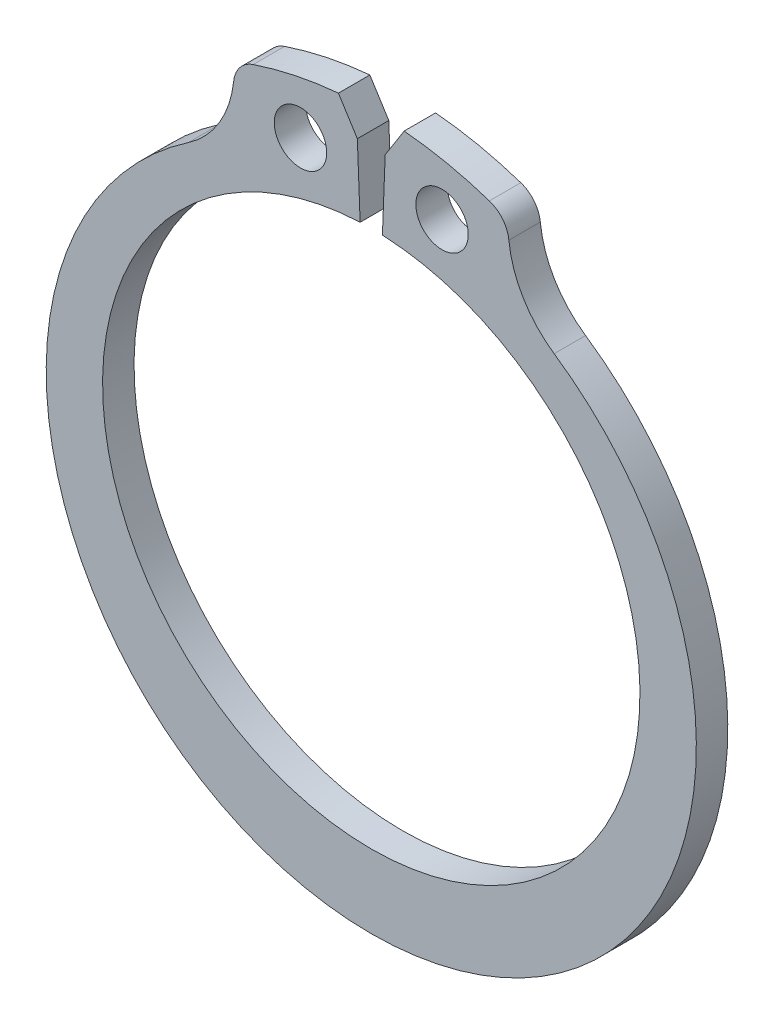
ISO-10303-21;
HEADER;
FILE_DESCRIPTION(('STEP AP214'),'2;1');
FILE_NAME('part.step','',(''),(''),'','','');
FILE_SCHEMA(('AUTOMOTIVE_DESIGN { 1 0 10303 214 1 1 1 1 }'));
ENDSEC;
DATA;
#1=APPLICATION_CONTEXT('core data for automotive mechanical design processes');
#2=APPLICATION_PROTOCOL_DEFINITION('international standard','automotive_design',2000,#1);
#3=PRODUCT_CONTEXT('',#1,'mechanical');
#4=PRODUCT('Part','Part','',(#3));
#5=PRODUCT_RELATED_PRODUCT_CATEGORY('part','',(#4));
#6=PRODUCT_DEFINITION_FORMATION('','',#4);
#7=PRODUCT_DEFINITION_CONTEXT('part definition',#1,'design');
#8=PRODUCT_DEFINITION('design','',#6,#7);
#9=PRODUCT_DEFINITION_SHAPE('','',#8);
#10=(LENGTH_UNIT() NAMED_UNIT(*) SI_UNIT(.MILLI.,.METRE.));
#11=(NAMED_UNIT(*) PLANE_ANGLE_UNIT() SI_UNIT($,.RADIAN.));
#12=(NAMED_UNIT(*) SI_UNIT($,.STERADIAN.) SOLID_ANGLE_UNIT());
#13=UNCERTAINTY_MEASURE_WITH_UNIT(LENGTH_MEASURE(1.E-05),#10,'distance_accuracy_value','');
#14=(GEOMETRIC_REPRESENTATION_CONTEXT(3) GLOBAL_UNCERTAINTY_ASSIGNED_CONTEXT((#13)) GLOBAL_UNIT_ASSIGNED_CONTEXT((#10,
#11,#12)) REPRESENTATION_CONTEXT('',''));
#15=CARTESIAN_POINT('',(0.,0.,0.));
#16=DIRECTION('',(0.,0.,1.));
#17=DIRECTION('',(1.,0.,0.));
#18=AXIS2_PLACEMENT_3D('',#15,#16,#17);
#19=CARTESIAN_POINT('',(4.55748367222768,0.231932071443037,1.2));
#20=DIRECTION('',(0.,0.,1.));
#21=DIRECTION('',(1.,0.,0.));
#22=AXIS2_PLACEMENT_3D('',#19,#20,#21);
#23=PLANE('',#22);
#24=CARTESIAN_POINT('',(2.7,11.8974787245029,1.2));
#25=DIRECTION('',(0.,0.,-1.));
#26=DIRECTION('',(1.,0.,0.));
#27=AXIS2_PLACEMENT_3D('',#24,#25,#26);
#28=CIRCLE('',#27,1.);
#29=CARTESIAN_POINT('',(1.7,11.8974787245029,1.2));
#30=VERTEX_POINT('',#29);
#31=EDGE_CURVE('E131',#30,#30,#28,.T.);
#32=ORIENTED_EDGE('',*,*,#31,.T.);
#33=EDGE_LOOP('',(#32));
#34=FACE_BOUND('',#33,.T.);
#35=CARTESIAN_POINT('',(-2.7,11.8974787245029,1.2));
#36=DIRECTION('',(0.,0.,-1.));
#37=DIRECTION('',(-1.,0.,0.));
#38=AXIS2_PLACEMENT_3D('',#35,#36,#37);
#39=CIRCLE('',#38,1.);
#40=CARTESIAN_POINT('',(-1.7,11.8974787245029,1.2));
#41=VERTEX_POINT('',#40);
#42=EDGE_CURVE('E117',#41,#41,#39,.T.);
#43=ORIENTED_EDGE('',*,*,#42,.T.);
#44=EDGE_LOOP('',(#43));
#45=FACE_BOUND('',#44,.T.);
#46=CARTESIAN_POINT('',(0.,0.,1.2));
#47=DIRECTION('',(0.,0.,-1.));
#48=DIRECTION('',(1.,0.,0.));
#49=AXIS2_PLACEMENT_3D('',#46,#47,#48);
#50=CIRCLE('',#49,10.25);
#51=CARTESIAN_POINT('',(0.425345306584372,10.2411708983967,1.2));
#52=VERTEX_POINT('',#51);
#53=CARTESIAN_POINT('',(-0.425345306584372,10.2411708983967,1.2));
#54=VERTEX_POINT('',#53);
#55=EDGE_CURVE('E148',#52,#54,#50,.T.);
#56=ORIENTED_EDGE('',*,*,#55,.T.);
#57=DIRECTION('',(-0.0390243902439026,0.999238258357881,0.));
#58=VECTOR('',#57,1.);
#59=CARTESIAN_POINT('',(0.,-0.65,1.2));
#60=LINE('',#59,#58);
#61=CARTESIAN_POINT('',(-0.531136295951343,12.95,1.2));
#62=VERTEX_POINT('',#61);
#63=EDGE_CURVE('E167',#54,#62,#60,.T.);
#64=ORIENTED_EDGE('',*,*,#63,.T.);
#65=DIRECTION('',(-0.533415242497357,0.845853521049293,0.));
#66=VECTOR('',#65,1.);
#67=CARTESIAN_POINT('',(-0.531136295951343,12.95,1.2));
#68=LINE('',#67,#66);
#69=CARTESIAN_POINT('',(-1.25283950188049,14.0944277351912,1.2));
#70=VERTEX_POINT('',#69);
#71=EDGE_CURVE('E128',#62,#70,#68,.T.);
#72=ORIENTED_EDGE('',*,*,#71,.T.);
#73=CARTESIAN_POINT('',(0.,0.,1.2));
#74=DIRECTION('',(0.,0.,-1.));
#75=DIRECTION('',(-1.,0.,0.));
#76=AXIS2_PLACEMENT_3D('',#73,#74,#75);
#77=CIRCLE('',#76,14.15);
#78=CARTESIAN_POINT('',(-4.50545087858349,13.4135533092716,1.2));
#79=VERTEX_POINT('',#78);
#80=EDGE_CURVE('E174',#79,#70,#77,.T.);
#81=ORIENTED_EDGE('',*,*,#80,.F.);
#82=CARTESIAN_POINT('',(-4.15520381381728,12.3708035820491,1.2));
#83=DIRECTION('',(0.,0.,-1.));
#84=DIRECTION('',(-1.,0.,0.));
#85=AXIS2_PLACEMENT_3D('',#82,#83,#84);
#86=CIRCLE('',#85,1.1);
#87=CARTESIAN_POINT('',(-5.24907893862705,12.4867225680799,1.2));
#88=VERTEX_POINT('',#87);
#89=EDGE_CURVE('E161',#88,#79,#86,.T.);
#90=ORIENTED_EDGE('',*,*,#89,.F.);
#91=CARTESIAN_POINT('',(-9.22680666520802,12.9082461536466,1.2));
#92=DIRECTION('',(0.,0.,-1.));
#93=DIRECTION('',(-1.,0.,0.));
#94=AXIS2_PLACEMENT_3D('',#91,#92,#93);
#95=CIRCLE('',#94,4.);
#96=CARTESIAN_POINT('',(-6.97636601515728,9.60135684787914,1.2));
#97=VERTEX_POINT('',#96);
#98=EDGE_CURVE('E129',#88,#97,#95,.T.);
#99=ORIENTED_EDGE('',*,*,#98,.T.);
#100=CARTESIAN_POINT('',(0.,-0.65,1.2));
#101=DIRECTION('',(0.,0.,-1.));
#102=DIRECTION('',(1.,0.,0.));
#103=AXIS2_PLACEMENT_3D('',#100,#101,#102);
#104=CIRCLE('',#103,12.4);
#105=CARTESIAN_POINT('',(6.97636601515728,9.60135684787914,1.2));
#106=VERTEX_POINT('',#105);
#107=EDGE_CURVE('E10',#106,#97,#104,.T.);
#108=ORIENTED_EDGE('',*,*,#107,.F.);
#109=CARTESIAN_POINT('',(9.22680666520802,12.9082461536466,1.2));
#110=DIRECTION('',(0.,0.,1.));
#111=DIRECTION('',(1.,0.,0.));
#112=AXIS2_PLACEMENT_3D('',#109,#110,#111);
#113=CIRCLE('',#112,4.);
#114=CARTESIAN_POINT('',(5.24907893862705,12.4867225680799,1.2));
#115=VERTEX_POINT('',#114);
#116=EDGE_CURVE('E158',#115,#106,#113,.T.);
#117=ORIENTED_EDGE('',*,*,#116,.F.);
#118=CARTESIAN_POINT('',(4.15520381381728,12.3708035820491,1.2));
#119=DIRECTION('',(0.,0.,-1.));
#120=DIRECTION('',(1.,0.,0.));
#121=AXIS2_PLACEMENT_3D('',#118,#119,#120);
#122=CIRCLE('',#121,1.1);
#123=CARTESIAN_POINT('',(4.50545087858349,13.4135533092716,1.2));
#124=VERTEX_POINT('',#123);
#125=EDGE_CURVE('E182',#124,#115,#122,.T.);
#126=ORIENTED_EDGE('',*,*,#125,.F.);
#127=CARTESIAN_POINT('',(0.,0.,1.2));
#128=DIRECTION('',(0.,0.,-1.));
#129=DIRECTION('',(1.,0.,0.));
#130=AXIS2_PLACEMENT_3D('',#127,#128,#129);
#131=CIRCLE('',#130,14.15);
#132=CARTESIAN_POINT('',(1.25283950188049,14.0944277351912,1.2));
#133=VERTEX_POINT('',#132);
#134=EDGE_CURVE('E195',#133,#124,#131,.T.);
#135=ORIENTED_EDGE('',*,*,#134,.F.);
#136=DIRECTION('',(0.533415242497357,0.845853521049293,0.));
#137=VECTOR('',#136,1.);
#138=CARTESIAN_POINT('',(0.531136295951343,12.95,1.2));
#139=LINE('',#138,#137);
#140=CARTESIAN_POINT('',(0.531136295951343,12.95,1.2));
#141=VERTEX_POINT('',#140);
#142=EDGE_CURVE('E133',#141,#133,#139,.T.);
#143=ORIENTED_EDGE('',*,*,#142,.F.);
#144=DIRECTION('',(0.0390243902439026,0.999238258357881,0.));
#145=VECTOR('',#144,1.);
#146=CARTESIAN_POINT('',(0.,-0.65,1.2));
#147=LINE('',#146,#145);
#148=EDGE_CURVE('E139',#52,#141,#147,.T.);
#149=ORIENTED_EDGE('',*,*,#148,.F.);
#150=EDGE_LOOP('',(#56,#64,#72,#81,#90,#99,#108,#117,#126,#135,#143,#149));
#151=FACE_BOUND('',#150,.T.);
#152=ADVANCED_FACE('F16',(#34,#45,#151),#23,.T.);
#153=CARTESIAN_POINT('',(0.,-0.65,0.));
#154=DIRECTION('',(0.,0.,-1.));
#155=DIRECTION('',(1.,0.,0.));
#156=AXIS2_PLACEMENT_3D('',#153,#154,#155);
#157=CYLINDRICAL_SURFACE('',#156,12.4);
#158=ORIENTED_EDGE('',*,*,#107,.T.);
#159=DIRECTION('',(0.,0.,-1.));
#160=VECTOR('',#159,1.);
#161=CARTESIAN_POINT('',(-6.97636601515728,9.60135684787914,1.2));
#162=LINE('',#161,#160);
#163=CARTESIAN_POINT('',(-6.97636601515728,9.60135684787914,0.));
#164=VERTEX_POINT('',#163);
#165=EDGE_CURVE('E132',#97,#164,#162,.T.);
#166=ORIENTED_EDGE('',*,*,#165,.T.);
#167=CARTESIAN_POINT('',(0.,-0.65,0.));
#168=DIRECTION('',(0.,0.,1.));
#169=DIRECTION('',(1.,0.,0.));
#170=AXIS2_PLACEMENT_3D('',#167,#168,#169);
#171=CIRCLE('',#170,12.4);
#172=CARTESIAN_POINT('',(6.97636601515728,9.60135684787914,0.));
#173=VERTEX_POINT('',#172);
#174=EDGE_CURVE('E149',#164,#173,#171,.T.);
#175=ORIENTED_EDGE('',*,*,#174,.T.);
#176=DIRECTION('',(0.,0.,1.));
#177=VECTOR('',#176,1.);
#178=CARTESIAN_POINT('',(6.97636601515728,9.60135684787914,0.));
#179=LINE('',#178,#177);
#180=EDGE_CURVE('E26',#173,#106,#179,.T.);
#181=ORIENTED_EDGE('',*,*,#180,.T.);
#182=EDGE_LOOP('',(#158,#166,#175,#181));
#183=FACE_BOUND('',#182,.T.);
#184=ADVANCED_FACE('F199',(#183),#157,.T.);
#185=CARTESIAN_POINT('',(9.22680666520802,12.9082461536466,0.));
#186=DIRECTION('',(0.,0.,-1.));
#187=DIRECTION('',(1.,0.,0.));
#188=AXIS2_PLACEMENT_3D('',#185,#186,#187);
#189=CYLINDRICAL_SURFACE('',#188,4.);
#190=ORIENTED_EDGE('',*,*,#116,.T.);
#191=ORIENTED_EDGE('',*,*,#180,.F.);
#192=CARTESIAN_POINT('',(9.22680666520802,12.9082461536466,0.));
#193=DIRECTION('',(0.,0.,1.));
#194=DIRECTION('',(1.,0.,0.));
#195=AXIS2_PLACEMENT_3D('',#192,#193,#194);
#196=CIRCLE('',#195,4.);
#197=CARTESIAN_POINT('',(5.24907893862705,12.4867225680799,0.));
#198=VERTEX_POINT('',#197);
#199=EDGE_CURVE('E152',#198,#173,#196,.T.);
#200=ORIENTED_EDGE('',*,*,#199,.F.);
#201=DIRECTION('',(0.,0.,1.));
#202=VECTOR('',#201,1.);
#203=CARTESIAN_POINT('',(5.24907893862705,12.4867225680799,0.));
#204=LINE('',#203,#202);
#205=EDGE_CURVE('E185',#198,#115,#204,.T.);
#206=ORIENTED_EDGE('',*,*,#205,.T.);
#207=EDGE_LOOP('',(#190,#191,#200,#206));
#208=FACE_BOUND('',#207,.T.);
#209=ADVANCED_FACE('F233',(#208),#189,.F.);
#210=CARTESIAN_POINT('',(4.15520381381728,12.3708035820491,0.));
#211=DIRECTION('',(0.,0.,-1.));
#212=DIRECTION('',(1.,0.,0.));
#213=AXIS2_PLACEMENT_3D('',#210,#211,#212);
#214=CYLINDRICAL_SURFACE('',#213,1.1);
#215=ORIENTED_EDGE('',*,*,#125,.T.);
#216=ORIENTED_EDGE('',*,*,#205,.F.);
#217=CARTESIAN_POINT('',(4.15520381381728,12.3708035820491,0.));
#218=DIRECTION('',(0.,0.,1.));
#219=DIRECTION('',(1.,0.,0.));
#220=AXIS2_PLACEMENT_3D('',#217,#218,#219);
#221=CIRCLE('',#220,1.1);
#222=CARTESIAN_POINT('',(4.50545087858349,13.4135533092716,0.));
#223=VERTEX_POINT('',#222);
#224=EDGE_CURVE('E153',#198,#223,#221,.T.);
#225=ORIENTED_EDGE('',*,*,#224,.T.);
#226=DIRECTION('',(0.,0.,1.));
#227=VECTOR('',#226,1.);
#228=CARTESIAN_POINT('',(4.50545087858349,13.4135533092716,0.));
#229=LINE('',#228,#227);
#230=EDGE_CURVE('E186',#223,#124,#229,.T.);
#231=ORIENTED_EDGE('',*,*,#230,.T.);
#232=EDGE_LOOP('',(#215,#216,#225,#231));
#233=FACE_BOUND('',#232,.T.);
#234=ADVANCED_FACE('F227',(#233),#214,.T.);
#235=CARTESIAN_POINT('',(0.,0.,0.));
#236=DIRECTION('',(0.,0.,-1.));
#237=DIRECTION('',(1.,0.,0.));
#238=AXIS2_PLACEMENT_3D('',#235,#236,#237);
#239=CYLINDRICAL_SURFACE('',#238,14.15);
#240=ORIENTED_EDGE('',*,*,#134,.T.);
#241=ORIENTED_EDGE('',*,*,#230,.F.);
#242=CARTESIAN_POINT('',(0.,0.,0.));
#243=DIRECTION('',(0.,0.,1.));
#244=DIRECTION('',(1.,0.,0.));
#245=AXIS2_PLACEMENT_3D('',#242,#243,#244);
#246=CIRCLE('',#245,14.15);
#247=CARTESIAN_POINT('',(1.25283950188049,14.0944277351912,0.));
#248=VERTEX_POINT('',#247);
#249=EDGE_CURVE('E156',#223,#248,#246,.T.);
#250=ORIENTED_EDGE('',*,*,#249,.T.);
#251=DIRECTION('',(0.,0.,1.));
#252=VECTOR('',#251,1.);
#253=CARTESIAN_POINT('',(1.25283950188049,14.0944277351912,0.));
#254=LINE('',#253,#252);
#255=EDGE_CURVE('E124',#248,#133,#254,.T.);
#256=ORIENTED_EDGE('',*,*,#255,.T.);
#257=EDGE_LOOP('',(#240,#241,#250,#256));
#258=FACE_BOUND('',#257,.T.);
#259=ADVANCED_FACE('F230',(#258),#239,.T.);
#260=CARTESIAN_POINT('',(0.891987898915916,13.5222138675956,0.));
#261=DIRECTION('',(-0.845853521049293,0.533415242497357,0.));
#262=DIRECTION('',(-0.533415242497357,-0.845853521049293,0.));
#263=AXIS2_PLACEMENT_3D('',#260,#261,#262);
#264=PLANE('',#263);
#265=ORIENTED_EDGE('',*,*,#142,.T.);
#266=ORIENTED_EDGE('',*,*,#255,.F.);
#267=DIRECTION('',(0.533415242497357,0.845853521049293,0.));
#268=VECTOR('',#267,1.);
#269=CARTESIAN_POINT('',(0.531136295951343,12.95,0.));
#270=LINE('',#269,#268);
#271=CARTESIAN_POINT('',(0.531136295951343,12.95,0.));
#272=VERTEX_POINT('',#271);
#273=EDGE_CURVE('E187',#272,#248,#270,.T.);
#274=ORIENTED_EDGE('',*,*,#273,.F.);
#275=DIRECTION('',(0.,0.,1.));
#276=VECTOR('',#275,1.);
#277=CARTESIAN_POINT('',(0.531136295951343,12.95,0.));
#278=LINE('',#277,#276);
#279=EDGE_CURVE('E135',#272,#141,#278,.T.);
#280=ORIENTED_EDGE('',*,*,#279,.T.);
#281=EDGE_LOOP('',(#265,#266,#274,#280));
#282=FACE_BOUND('',#281,.T.);
#283=ADVANCED_FACE('F256',(#282),#264,.T.);
#284=CARTESIAN_POINT('',(0.278260743283332,6.475,0.));
#285=DIRECTION('',(-0.999238258357881,0.0390243902439027,0.));
#286=DIRECTION('',(-0.0390243902439027,-0.999238258357881,0.));
#287=AXIS2_PLACEMENT_3D('',#284,#285,#286);
#288=PLANE('',#287);
#289=DIRECTION('',(0.,0.,1.));
#290=VECTOR('',#289,1.);
#291=CARTESIAN_POINT('',(0.425345306584372,10.2411708983967,0.6));
#292=LINE('',#291,#290);
#293=CARTESIAN_POINT('',(0.425345306584372,10.2411708983967,0.));
#294=VERTEX_POINT('',#293);
#295=EDGE_CURVE('E176',#294,#52,#292,.T.);
#296=ORIENTED_EDGE('',*,*,#295,.T.);
#297=ORIENTED_EDGE('',*,*,#148,.T.);
#298=ORIENTED_EDGE('',*,*,#279,.F.);
#299=DIRECTION('',(0.0390243902439026,0.999238258357881,0.));
#300=VECTOR('',#299,1.);
#301=CARTESIAN_POINT('',(0.,-0.65,0.));
#302=LINE('',#301,#300);
#303=EDGE_CURVE('E190',#294,#272,#302,.T.);
#304=ORIENTED_EDGE('',*,*,#303,.F.);
#305=EDGE_LOOP('',(#296,#297,#298,#304));
#306=FACE_BOUND('',#305,.T.);
#307=ADVANCED_FACE('F252',(#306),#288,.T.);
#308=CARTESIAN_POINT('',(2.7,11.8974787245029,0.6));
#309=DIRECTION('',(0.,0.,-1.));
#310=DIRECTION('',(1.,0.,0.));
#311=AXIS2_PLACEMENT_3D('',#308,#309,#310);
#312=CYLINDRICAL_SURFACE('',#311,1.);
#313=ORIENTED_EDGE('',*,*,#31,.F.);
#314=EDGE_LOOP('',(#313));
#315=FACE_BOUND('',#314,.T.);
#316=CARTESIAN_POINT('',(2.7,11.8974787245029,0.));
#317=DIRECTION('',(0.,0.,1.));
#318=DIRECTION('',(1.,0.,0.));
#319=AXIS2_PLACEMENT_3D('',#316,#317,#318);
#320=CIRCLE('',#319,1.);
#321=CARTESIAN_POINT('',(1.7,11.8974787245029,0.));
#322=VERTEX_POINT('',#321);
#323=EDGE_CURVE('E110',#322,#322,#320,.T.);
#324=ORIENTED_EDGE('',*,*,#323,.F.);
#325=EDGE_LOOP('',(#324));
#326=FACE_BOUND('',#325,.T.);
#327=ADVANCED_FACE('F255',(#315,#326),#312,.F.);
#328=CARTESIAN_POINT('',(-9.22680666520802,12.9082461536466,1.2));
#329=DIRECTION('',(0.,0.,1.));
#330=DIRECTION('',(-1.,0.,0.));
#331=AXIS2_PLACEMENT_3D('',#328,#329,#330);
#332=CYLINDRICAL_SURFACE('',#331,4.);
#333=CARTESIAN_POINT('',(-9.22680666520802,12.9082461536466,0.));
#334=DIRECTION('',(0.,0.,-1.));
#335=DIRECTION('',(-1.,0.,0.));
#336=AXIS2_PLACEMENT_3D('',#333,#334,#335);
#337=CIRCLE('',#336,4.);
#338=CARTESIAN_POINT('',(-5.24907893862705,12.4867225680799,0.));
#339=VERTEX_POINT('',#338);
#340=EDGE_CURVE('E142',#339,#164,#337,.T.);
#341=ORIENTED_EDGE('',*,*,#340,.T.);
#342=ORIENTED_EDGE('',*,*,#165,.F.);
#343=ORIENTED_EDGE('',*,*,#98,.F.);
#344=DIRECTION('',(0.,0.,-1.));
#345=VECTOR('',#344,1.);
#346=CARTESIAN_POINT('',(-5.24907893862705,12.4867225680799,1.2));
#347=LINE('',#346,#345);
#348=EDGE_CURVE('E163',#88,#339,#347,.T.);
#349=ORIENTED_EDGE('',*,*,#348,.T.);
#350=EDGE_LOOP('',(#341,#342,#343,#349));
#351=FACE_BOUND('',#350,.T.);
#352=ADVANCED_FACE('F205',(#351),#332,.F.);
#353=CARTESIAN_POINT('',(-4.15520381381728,12.3708035820491,1.2));
#354=DIRECTION('',(0.,0.,1.));
#355=DIRECTION('',(-1.,0.,0.));
#356=AXIS2_PLACEMENT_3D('',#353,#354,#355);
#357=CYLINDRICAL_SURFACE('',#356,1.1);
#358=CARTESIAN_POINT('',(-4.15520381381728,12.3708035820491,0.));
#359=DIRECTION('',(0.,0.,1.));
#360=DIRECTION('',(-1.,0.,0.));
#361=AXIS2_PLACEMENT_3D('',#358,#359,#360);
#362=CIRCLE('',#361,1.1);
#363=CARTESIAN_POINT('',(-4.50545087858349,13.4135533092716,0.));
#364=VERTEX_POINT('',#363);
#365=EDGE_CURVE('E140',#364,#339,#362,.T.);
#366=ORIENTED_EDGE('',*,*,#365,.T.);
#367=ORIENTED_EDGE('',*,*,#348,.F.);
#368=ORIENTED_EDGE('',*,*,#89,.T.);
#369=DIRECTION('',(0.,0.,-1.));
#370=VECTOR('',#369,1.);
#371=CARTESIAN_POINT('',(-4.50545087858349,13.4135533092716,1.2));
#372=LINE('',#371,#370);
#373=EDGE_CURVE('E20',#79,#364,#372,.T.);
#374=ORIENTED_EDGE('',*,*,#373,.T.);
#375=EDGE_LOOP('',(#366,#367,#368,#374));
#376=FACE_BOUND('',#375,.T.);
#377=ADVANCED_FACE('F284',(#376),#357,.T.);
#378=CARTESIAN_POINT('',(0.,0.,1.2));
#379=DIRECTION('',(0.,0.,1.));
#380=DIRECTION('',(-1.,0.,0.));
#381=AXIS2_PLACEMENT_3D('',#378,#379,#380);
#382=CYLINDRICAL_SURFACE('',#381,14.15);
#383=CARTESIAN_POINT('',(0.,0.,0.));
#384=DIRECTION('',(0.,0.,1.));
#385=DIRECTION('',(-1.,0.,0.));
#386=AXIS2_PLACEMENT_3D('',#383,#384,#385);
#387=CIRCLE('',#386,14.15);
#388=CARTESIAN_POINT('',(-1.25283950188049,14.0944277351912,0.));
#389=VERTEX_POINT('',#388);
#390=EDGE_CURVE('E120',#389,#364,#387,.T.);
#391=ORIENTED_EDGE('',*,*,#390,.T.);
#392=ORIENTED_EDGE('',*,*,#373,.F.);
#393=ORIENTED_EDGE('',*,*,#80,.T.);
#394=DIRECTION('',(0.,0.,-1.));
#395=VECTOR('',#394,1.);
#396=CARTESIAN_POINT('',(-1.25283950188049,14.0944277351912,1.2));
#397=LINE('',#396,#395);
#398=EDGE_CURVE('E126',#70,#389,#397,.T.);
#399=ORIENTED_EDGE('',*,*,#398,.T.);
#400=EDGE_LOOP('',(#391,#392,#393,#399));
#401=FACE_BOUND('',#400,.T.);
#402=ADVANCED_FACE('F282',(#401),#382,.T.);
#403=CARTESIAN_POINT('',(-0.891987898915916,13.5222138675956,1.2));
#404=DIRECTION('',(0.845853521049293,0.533415242497357,0.));
#405=DIRECTION('',(0.533415242497357,-0.845853521049293,0.));
#406=AXIS2_PLACEMENT_3D('',#403,#404,#405);
#407=PLANE('',#406);
#408=DIRECTION('',(-0.533415242497357,0.845853521049293,0.));
#409=VECTOR('',#408,1.);
#410=CARTESIAN_POINT('',(-0.531136295951343,12.95,0.));
#411=LINE('',#410,#409);
#412=CARTESIAN_POINT('',(-0.531136295951343,12.95,0.));
#413=VERTEX_POINT('',#412);
#414=EDGE_CURVE('E115',#413,#389,#411,.T.);
#415=ORIENTED_EDGE('',*,*,#414,.T.);
#416=ORIENTED_EDGE('',*,*,#398,.F.);
#417=ORIENTED_EDGE('',*,*,#71,.F.);
#418=DIRECTION('',(0.,0.,-1.));
#419=VECTOR('',#418,1.);
#420=CARTESIAN_POINT('',(-0.531136295951343,12.95,1.2));
#421=LINE('',#420,#419);
#422=EDGE_CURVE('E147',#62,#413,#421,.T.);
#423=ORIENTED_EDGE('',*,*,#422,.T.);
#424=EDGE_LOOP('',(#415,#416,#417,#423));
#425=FACE_BOUND('',#424,.T.);
#426=ADVANCED_FACE('F18',(#425),#407,.T.);
#427=CARTESIAN_POINT('',(-2.7,11.8974787245029,0.6));
#428=DIRECTION('',(0.,0.,1.));
#429=DIRECTION('',(-1.,0.,0.));
#430=AXIS2_PLACEMENT_3D('',#427,#428,#429);
#431=CYLINDRICAL_SURFACE('',#430,1.);
#432=CARTESIAN_POINT('',(-2.7,11.8974787245029,0.));
#433=DIRECTION('',(0.,0.,1.));
#434=DIRECTION('',(-1.,0.,0.));
#435=AXIS2_PLACEMENT_3D('',#432,#433,#434);
#436=CIRCLE('',#435,1.);
#437=CARTESIAN_POINT('',(-1.7,11.8974787245029,0.));
#438=VERTEX_POINT('',#437);
#439=EDGE_CURVE('E114',#438,#438,#436,.T.);
#440=ORIENTED_EDGE('',*,*,#439,.F.);
#441=EDGE_LOOP('',(#440));
#442=FACE_BOUND('',#441,.T.);
#443=ORIENTED_EDGE('',*,*,#42,.F.);
#444=EDGE_LOOP('',(#443));
#445=FACE_BOUND('',#444,.T.);
#446=ADVANCED_FACE('F302',(#442,#445),#431,.F.);
#447=CARTESIAN_POINT('',(4.55748367222768,0.231932071443037,0.));
#448=DIRECTION('',(0.,0.,1.));
#449=DIRECTION('',(1.,0.,0.));
#450=AXIS2_PLACEMENT_3D('',#447,#448,#449);
#451=PLANE('',#450);
#452=ORIENTED_EDGE('',*,*,#439,.T.);
#453=EDGE_LOOP('',(#452));
#454=FACE_BOUND('',#453,.T.);
#455=ORIENTED_EDGE('',*,*,#323,.T.);
#456=EDGE_LOOP('',(#455));
#457=FACE_BOUND('',#456,.T.);
#458=CARTESIAN_POINT('',(0.,0.,0.));
#459=DIRECTION('',(0.,0.,1.));
#460=DIRECTION('',(1.,0.,0.));
#461=AXIS2_PLACEMENT_3D('',#458,#459,#460);
#462=CIRCLE('',#461,10.25);
#463=CARTESIAN_POINT('',(-0.425345306584372,10.2411708983967,0.));
#464=VERTEX_POINT('',#463);
#465=EDGE_CURVE('E179',#464,#294,#462,.T.);
#466=ORIENTED_EDGE('',*,*,#465,.T.);
#467=ORIENTED_EDGE('',*,*,#303,.T.);
#468=ORIENTED_EDGE('',*,*,#273,.T.);
#469=ORIENTED_EDGE('',*,*,#249,.F.);
#470=ORIENTED_EDGE('',*,*,#224,.F.);
#471=ORIENTED_EDGE('',*,*,#199,.T.);
#472=ORIENTED_EDGE('',*,*,#174,.F.);
#473=ORIENTED_EDGE('',*,*,#340,.F.);
#474=ORIENTED_EDGE('',*,*,#365,.F.);
#475=ORIENTED_EDGE('',*,*,#390,.F.);
#476=ORIENTED_EDGE('',*,*,#414,.F.);
#477=DIRECTION('',(-0.0390243902439026,0.999238258357881,0.));
#478=VECTOR('',#477,1.);
#479=CARTESIAN_POINT('',(0.,-0.65,0.));
#480=LINE('',#479,#478);
#481=EDGE_CURVE('E144',#464,#413,#480,.T.);
#482=ORIENTED_EDGE('',*,*,#481,.F.);
#483=EDGE_LOOP('',(#466,#467,#468,#469,#470,#471,#472,#473,#474,#475,#476,#482));
#484=FACE_BOUND('',#483,.T.);
#485=ADVANCED_FACE('F111',(#454,#457,#484),#451,.F.);
#486=CARTESIAN_POINT('',(-0.278260743283332,6.475,1.2));
#487=DIRECTION('',(0.999238258357881,0.0390243902439027,0.));
#488=DIRECTION('',(0.0390243902439027,-0.999238258357881,0.));
#489=AXIS2_PLACEMENT_3D('',#486,#487,#488);
#490=PLANE('',#489);
#491=DIRECTION('',(0.,0.,-1.));
#492=VECTOR('',#491,1.);
#493=CARTESIAN_POINT('',(-0.425345306584372,10.2411708983967,0.6));
#494=LINE('',#493,#492);
#495=EDGE_CURVE('E170',#54,#464,#494,.T.);
#496=ORIENTED_EDGE('',*,*,#495,.T.);
#497=ORIENTED_EDGE('',*,*,#481,.T.);
#498=ORIENTED_EDGE('',*,*,#422,.F.);
#499=ORIENTED_EDGE('',*,*,#63,.F.);
#500=EDGE_LOOP('',(#496,#497,#498,#499));
#501=FACE_BOUND('',#500,.T.);
#502=ADVANCED_FACE('F262',(#501),#490,.T.);
#503=CARTESIAN_POINT('',(0.,0.,0.6));
#504=DIRECTION('',(0.,0.,-1.));
#505=DIRECTION('',(1.,0.,0.));
#506=AXIS2_PLACEMENT_3D('',#503,#504,#505);
#507=CYLINDRICAL_SURFACE('',#506,10.25);
#508=ORIENTED_EDGE('',*,*,#295,.F.);
#509=ORIENTED_EDGE('',*,*,#465,.F.);
#510=ORIENTED_EDGE('',*,*,#495,.F.);
#511=ORIENTED_EDGE('',*,*,#55,.F.);
#512=EDGE_LOOP('',(#508,#509,#510,#511));
#513=FACE_BOUND('',#512,.T.);
#514=ADVANCED_FACE('F260',(#513),#507,.F.);
#515=CLOSED_SHELL('',(#152,#184,#209,#234,#259,#283,#307,#327,#352,#377,#402,#426,#446,#485,
#502,#514));
#516=MANIFOLD_SOLID_BREP('B1',#515);
#517=ADVANCED_BREP_SHAPE_REPRESENTATION('',(#18,#516),#14);
#518=SHAPE_DEFINITION_REPRESENTATION(#9,#517);
ENDSEC;
END-ISO-10303-21;
